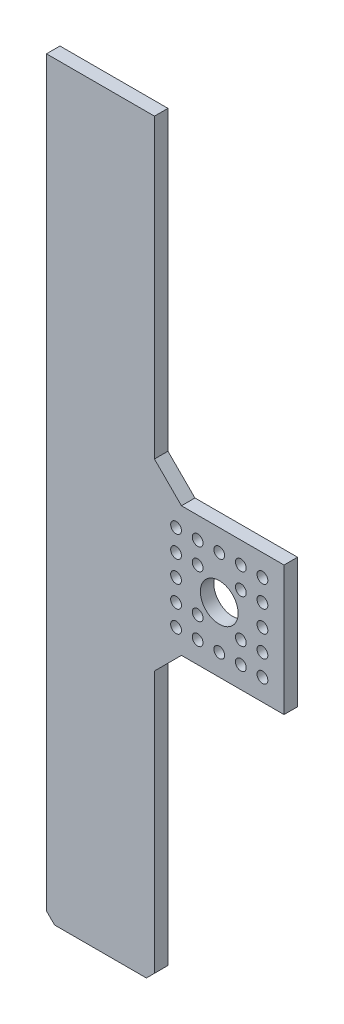
ISO-10303-21;
HEADER;
FILE_DESCRIPTION(('STEP AP214'),'2;1');
FILE_NAME('part.step','',(''),(''),'','','');
FILE_SCHEMA(('AUTOMOTIVE_DESIGN { 1 0 10303 214 1 1 1 1 }'));
ENDSEC;
DATA;
#1=APPLICATION_CONTEXT('core data for automotive mechanical design processes');
#2=APPLICATION_PROTOCOL_DEFINITION('international standard','automotive_design',2000,#1);
#3=PRODUCT_CONTEXT('',#1,'mechanical');
#4=PRODUCT('Part','Part','',(#3));
#5=PRODUCT_RELATED_PRODUCT_CATEGORY('part','',(#4));
#6=PRODUCT_DEFINITION_FORMATION('','',#4);
#7=PRODUCT_DEFINITION_CONTEXT('part definition',#1,'design');
#8=PRODUCT_DEFINITION('design','',#6,#7);
#9=PRODUCT_DEFINITION_SHAPE('','',#8);
#10=(LENGTH_UNIT() NAMED_UNIT(*) SI_UNIT(.MILLI.,.METRE.));
#11=(NAMED_UNIT(*) PLANE_ANGLE_UNIT() SI_UNIT($,.RADIAN.));
#12=(NAMED_UNIT(*) SI_UNIT($,.STERADIAN.) SOLID_ANGLE_UNIT());
#13=UNCERTAINTY_MEASURE_WITH_UNIT(LENGTH_MEASURE(1.E-05),#10,'distance_accuracy_value','');
#14=(GEOMETRIC_REPRESENTATION_CONTEXT(3) GLOBAL_UNCERTAINTY_ASSIGNED_CONTEXT((#13)) GLOBAL_UNIT_ASSIGNED_CONTEXT((#10,
#11,#12)) REPRESENTATION_CONTEXT('',''));
#15=CARTESIAN_POINT('',(0.,0.,0.));
#16=DIRECTION('',(0.,0.,1.));
#17=DIRECTION('',(1.,0.,0.));
#18=AXIS2_PLACEMENT_3D('',#15,#16,#17);
#19=CARTESIAN_POINT('',(0.,0.,5.));
#20=DIRECTION('',(0.,0.,1.));
#21=DIRECTION('',(1.,0.,0.));
#22=AXIS2_PLACEMENT_3D('',#19,#20,#21);
#23=PLANE('',#22);
#24=CARTESIAN_POINT('',(48.0000000000002,-152.,5.));
#25=DIRECTION('',(0.,0.,1.));
#26=DIRECTION('',(1.,0.,0.));
#27=AXIS2_PLACEMENT_3D('',#24,#25,#26);
#28=CIRCLE('',#27,2.);
#29=CARTESIAN_POINT('',(50.0000000000003,-152.,5.));
#30=VERTEX_POINT('',#29);
#31=EDGE_CURVE('E442',#30,#30,#28,.T.);
#32=ORIENTED_EDGE('',*,*,#31,.F.);
#33=EDGE_LOOP('',(#32));
#34=FACE_BOUND('',#33,.T.);
#35=CARTESIAN_POINT('',(48.0000000000001,-136.,5.));
#36=DIRECTION('',(0.,0.,1.));
#37=DIRECTION('',(1.,0.,0.));
#38=AXIS2_PLACEMENT_3D('',#35,#36,#37);
#39=CIRCLE('',#38,2.);
#40=CARTESIAN_POINT('',(50.0000000000001,-136.,5.));
#41=VERTEX_POINT('',#40);
#42=EDGE_CURVE('E426',#41,#41,#39,.T.);
#43=ORIENTED_EDGE('',*,*,#42,.F.);
#44=EDGE_LOOP('',(#43));
#45=FACE_BOUND('',#44,.T.);
#46=CARTESIAN_POINT('',(72.0000000000003,-160.,5.));
#47=DIRECTION('',(0.,0.,1.));
#48=DIRECTION('',(1.,0.,0.));
#49=AXIS2_PLACEMENT_3D('',#46,#47,#48);
#50=CIRCLE('',#49,2.00000000000001);
#51=CARTESIAN_POINT('',(74.0000000000003,-160.,5.));
#52=VERTEX_POINT('',#51);
#53=EDGE_CURVE('E410',#52,#52,#50,.T.);
#54=ORIENTED_EDGE('',*,*,#53,.F.);
#55=EDGE_LOOP('',(#54));
#56=FACE_BOUND('',#55,.T.);
#57=CARTESIAN_POINT('',(56.0000000000003,-160.,5.));
#58=DIRECTION('',(0.,0.,1.));
#59=DIRECTION('',(1.,0.,0.));
#60=AXIS2_PLACEMENT_3D('',#57,#58,#59);
#61=CIRCLE('',#60,2.);
#62=CARTESIAN_POINT('',(58.0000000000003,-160.,5.));
#63=VERTEX_POINT('',#62);
#64=EDGE_CURVE('E394',#63,#63,#61,.T.);
#65=ORIENTED_EDGE('',*,*,#64,.F.);
#66=EDGE_LOOP('',(#65));
#67=FACE_BOUND('',#66,.T.);
#68=CARTESIAN_POINT('',(72.0000000000002,-152.,5.));
#69=DIRECTION('',(0.,0.,1.));
#70=DIRECTION('',(1.,0.,0.));
#71=AXIS2_PLACEMENT_3D('',#68,#69,#70);
#72=CIRCLE('',#71,2.00000000000001);
#73=CARTESIAN_POINT('',(74.0000000000002,-152.,5.));
#74=VERTEX_POINT('',#73);
#75=EDGE_CURVE('E378',#74,#74,#72,.T.);
#76=ORIENTED_EDGE('',*,*,#75,.F.);
#77=EDGE_LOOP('',(#76));
#78=FACE_BOUND('',#77,.T.);
#79=CARTESIAN_POINT('',(80.0000000000001,-144.,5.));
#80=DIRECTION('',(0.,0.,1.));
#81=DIRECTION('',(1.,0.,0.));
#82=AXIS2_PLACEMENT_3D('',#79,#80,#81);
#83=CIRCLE('',#82,2.);
#84=CARTESIAN_POINT('',(82.0000000000001,-144.,5.));
#85=VERTEX_POINT('',#84);
#86=EDGE_CURVE('E362',#85,#85,#83,.T.);
#87=ORIENTED_EDGE('',*,*,#86,.F.);
#88=EDGE_LOOP('',(#87));
#89=FACE_BOUND('',#88,.T.);
#90=CARTESIAN_POINT('',(72.0000000000001,-136.,5.));
#91=DIRECTION('',(0.,0.,1.));
#92=DIRECTION('',(1.,0.,0.));
#93=AXIS2_PLACEMENT_3D('',#90,#91,#92);
#94=CIRCLE('',#93,2.00000000000001);
#95=CARTESIAN_POINT('',(74.0000000000001,-136.,5.));
#96=VERTEX_POINT('',#95);
#97=EDGE_CURVE('E346',#96,#96,#94,.T.);
#98=ORIENTED_EDGE('',*,*,#97,.F.);
#99=EDGE_LOOP('',(#98));
#100=FACE_BOUND('',#99,.T.);
#101=CARTESIAN_POINT('',(80.,-128.,5.));
#102=DIRECTION('',(0.,0.,1.));
#103=DIRECTION('',(1.,0.,0.));
#104=AXIS2_PLACEMENT_3D('',#101,#102,#103);
#105=CIRCLE('',#104,2.);
#106=CARTESIAN_POINT('',(82.,-128.,5.));
#107=VERTEX_POINT('',#106);
#108=EDGE_CURVE('E330',#107,#107,#105,.T.);
#109=ORIENTED_EDGE('',*,*,#108,.F.);
#110=EDGE_LOOP('',(#109));
#111=FACE_BOUND('',#110,.T.);
#112=CARTESIAN_POINT('',(64.,-128.,5.));
#113=DIRECTION('',(0.,0.,1.));
#114=DIRECTION('',(1.,0.,0.));
#115=AXIS2_PLACEMENT_3D('',#112,#113,#114);
#116=CIRCLE('',#115,2.00000000000001);
#117=CARTESIAN_POINT('',(66.,-128.,5.));
#118=VERTEX_POINT('',#117);
#119=EDGE_CURVE('E314',#118,#118,#116,.T.);
#120=ORIENTED_EDGE('',*,*,#119,.F.);
#121=EDGE_LOOP('',(#120));
#122=FACE_BOUND('',#121,.T.);
#123=CARTESIAN_POINT('',(48.,-128.,5.));
#124=DIRECTION('',(0.,0.,1.));
#125=DIRECTION('',(1.,0.,0.));
#126=AXIS2_PLACEMENT_3D('',#123,#124,#125);
#127=CIRCLE('',#126,2.);
#128=CARTESIAN_POINT('',(50.,-128.,5.));
#129=VERTEX_POINT('',#128);
#130=EDGE_CURVE('E298',#129,#129,#127,.T.);
#131=ORIENTED_EDGE('',*,*,#130,.F.);
#132=EDGE_LOOP('',(#131));
#133=FACE_BOUND('',#132,.T.);
#134=DIRECTION('',(0.,-1.,0.));
#135=VECTOR('',#134,1.);
#136=CARTESIAN_POINT('',(0.,0.,5.));
#137=LINE('',#136,#135);
#138=CARTESIAN_POINT('',(0.,0.,5.));
#139=VERTEX_POINT('',#138);
#140=CARTESIAN_POINT('',(0.,-275.,5.));
#141=VERTEX_POINT('',#140);
#142=EDGE_CURVE('E132',#139,#141,#137,.T.);
#143=ORIENTED_EDGE('',*,*,#142,.T.);
#144=DIRECTION('',(-0.707106781186541,0.707106781186554,0.));
#145=VECTOR('',#144,1.);
#146=CARTESIAN_POINT('',(-137.5,-137.499999999997,5.));
#147=LINE('',#146,#145);
#148=CARTESIAN_POINT('',(3.00000000000004,-278.,5.));
#149=VERTEX_POINT('',#148);
#150=EDGE_CURVE('E187',#141,#149,#147,.F.);
#151=ORIENTED_EDGE('',*,*,#150,.T.);
#152=DIRECTION('',(1.,0.,0.));
#153=VECTOR('',#152,1.);
#154=CARTESIAN_POINT('',(0.,-278.,5.));
#155=LINE('',#154,#153);
#156=CARTESIAN_POINT('',(37.,-278.,5.));
#157=VERTEX_POINT('',#156);
#158=EDGE_CURVE('E144',#149,#157,#155,.T.);
#159=ORIENTED_EDGE('',*,*,#158,.T.);
#160=DIRECTION('',(-0.707106781186548,-0.707106781186548,0.));
#161=VECTOR('',#160,1.);
#162=CARTESIAN_POINT('',(157.5,-157.5,5.));
#163=LINE('',#162,#161);
#164=CARTESIAN_POINT('',(40.,-275.,5.));
#165=VERTEX_POINT('',#164);
#166=EDGE_CURVE('E184',#157,#165,#163,.F.);
#167=ORIENTED_EDGE('',*,*,#166,.T.);
#168=DIRECTION('',(0.,1.,0.));
#169=VECTOR('',#168,1.);
#170=CARTESIAN_POINT('',(40.,-278.,5.));
#171=LINE('',#170,#169);
#172=CARTESIAN_POINT('',(40.,-178.,5.));
#173=VERTEX_POINT('',#172);
#174=EDGE_CURVE('E219',#165,#173,#171,.T.);
#175=ORIENTED_EDGE('',*,*,#174,.T.);
#176=DIRECTION('',(-0.707106781186551,-0.707106781186544,0.));
#177=VECTOR('',#176,1.);
#178=CARTESIAN_POINT('',(50.0000000000001,-168.,5.));
#179=LINE('',#178,#177);
#180=CARTESIAN_POINT('',(50.0000000000001,-168.,5.));
#181=VERTEX_POINT('',#180);
#182=EDGE_CURVE('E210',#173,#181,#179,.F.);
#183=ORIENTED_EDGE('',*,*,#182,.T.);
#184=DIRECTION('',(1.,0.,0.));
#185=VECTOR('',#184,1.);
#186=CARTESIAN_POINT('',(40.,-168.,5.));
#187=LINE('',#186,#185);
#188=CARTESIAN_POINT('',(88.,-168.,5.));
#189=VERTEX_POINT('',#188);
#190=EDGE_CURVE('E216',#181,#189,#187,.T.);
#191=ORIENTED_EDGE('',*,*,#190,.T.);
#192=DIRECTION('',(0.,1.,0.));
#193=VECTOR('',#192,1.);
#194=CARTESIAN_POINT('',(88.,-168.,5.));
#195=LINE('',#194,#193);
#196=CARTESIAN_POINT('',(88.,-120.,5.));
#197=VERTEX_POINT('',#196);
#198=EDGE_CURVE('E228',#189,#197,#195,.T.);
#199=ORIENTED_EDGE('',*,*,#198,.T.);
#200=DIRECTION('',(-1.,0.,0.));
#201=VECTOR('',#200,1.);
#202=CARTESIAN_POINT('',(88.,-120.,5.));
#203=LINE('',#202,#201);
#204=CARTESIAN_POINT('',(49.9999999999999,-120.,5.));
#205=VERTEX_POINT('',#204);
#206=EDGE_CURVE('E267',#197,#205,#203,.T.);
#207=ORIENTED_EDGE('',*,*,#206,.T.);
#208=DIRECTION('',(0.707106781186544,-0.707106781186551,0.));
#209=VECTOR('',#208,1.);
#210=CARTESIAN_POINT('',(40.,-110.,5.));
#211=LINE('',#210,#209);
#212=CARTESIAN_POINT('',(40.,-110.,5.));
#213=VERTEX_POINT('',#212);
#214=EDGE_CURVE('E11',#205,#213,#211,.F.);
#215=ORIENTED_EDGE('',*,*,#214,.T.);
#216=DIRECTION('',(0.,1.,0.));
#217=VECTOR('',#216,1.);
#218=CARTESIAN_POINT('',(40.,-120.,5.));
#219=LINE('',#218,#217);
#220=CARTESIAN_POINT('',(40.,0.,5.));
#221=VERTEX_POINT('',#220);
#222=EDGE_CURVE('E150',#213,#221,#219,.T.);
#223=ORIENTED_EDGE('',*,*,#222,.T.);
#224=DIRECTION('',(-1.,0.,0.));
#225=VECTOR('',#224,1.);
#226=CARTESIAN_POINT('',(40.,0.,5.));
#227=LINE('',#226,#225);
#228=EDGE_CURVE('E145',#221,#139,#227,.T.);
#229=ORIENTED_EDGE('',*,*,#228,.T.);
#230=EDGE_LOOP('',(#143,#151,#159,#167,#175,#183,#191,#199,#207,#215,#223,#229));
#231=FACE_BOUND('',#230,.T.);
#232=CARTESIAN_POINT('',(64.,-144.,5.));
#233=DIRECTION('',(0.,0.,1.));
#234=DIRECTION('',(1.,0.,0.));
#235=AXIS2_PLACEMENT_3D('',#232,#233,#234);
#236=CIRCLE('',#235,7.);
#237=CARTESIAN_POINT('',(71.,-144.,5.));
#238=VERTEX_POINT('',#237);
#239=EDGE_CURVE('E279',#238,#238,#236,.T.);
#240=ORIENTED_EDGE('',*,*,#239,.F.);
#241=EDGE_LOOP('',(#240));
#242=FACE_BOUND('',#241,.T.);
#243=CARTESIAN_POINT('',(56.,-128.,5.));
#244=DIRECTION('',(0.,0.,1.));
#245=DIRECTION('',(1.,0.,0.));
#246=AXIS2_PLACEMENT_3D('',#243,#244,#245);
#247=CIRCLE('',#246,2.);
#248=CARTESIAN_POINT('',(58.,-128.,5.));
#249=VERTEX_POINT('',#248);
#250=EDGE_CURVE('E306',#249,#249,#247,.T.);
#251=ORIENTED_EDGE('',*,*,#250,.F.);
#252=EDGE_LOOP('',(#251));
#253=FACE_BOUND('',#252,.T.);
#254=CARTESIAN_POINT('',(72.,-128.,5.));
#255=DIRECTION('',(0.,0.,1.));
#256=DIRECTION('',(1.,0.,0.));
#257=AXIS2_PLACEMENT_3D('',#254,#255,#256);
#258=CIRCLE('',#257,2.00000000000001);
#259=CARTESIAN_POINT('',(74.,-128.,5.));
#260=VERTEX_POINT('',#259);
#261=EDGE_CURVE('E322',#260,#260,#258,.T.);
#262=ORIENTED_EDGE('',*,*,#261,.F.);
#263=EDGE_LOOP('',(#262));
#264=FACE_BOUND('',#263,.T.);
#265=CARTESIAN_POINT('',(56.0000000000001,-136.,5.));
#266=DIRECTION('',(0.,0.,1.));
#267=DIRECTION('',(1.,0.,0.));
#268=AXIS2_PLACEMENT_3D('',#265,#266,#267);
#269=CIRCLE('',#268,2.);
#270=CARTESIAN_POINT('',(58.0000000000001,-136.,5.));
#271=VERTEX_POINT('',#270);
#272=EDGE_CURVE('E338',#271,#271,#269,.T.);
#273=ORIENTED_EDGE('',*,*,#272,.F.);
#274=EDGE_LOOP('',(#273));
#275=FACE_BOUND('',#274,.T.);
#276=CARTESIAN_POINT('',(80.0000000000001,-136.,5.));
#277=DIRECTION('',(0.,0.,1.));
#278=DIRECTION('',(1.,0.,0.));
#279=AXIS2_PLACEMENT_3D('',#276,#277,#278);
#280=CIRCLE('',#279,2.);
#281=CARTESIAN_POINT('',(82.0000000000001,-136.,5.));
#282=VERTEX_POINT('',#281);
#283=EDGE_CURVE('E354',#282,#282,#280,.T.);
#284=ORIENTED_EDGE('',*,*,#283,.F.);
#285=EDGE_LOOP('',(#284));
#286=FACE_BOUND('',#285,.T.);
#287=CARTESIAN_POINT('',(56.0000000000002,-152.,5.));
#288=DIRECTION('',(0.,0.,1.));
#289=DIRECTION('',(1.,0.,0.));
#290=AXIS2_PLACEMENT_3D('',#287,#288,#289);
#291=CIRCLE('',#290,2.);
#292=CARTESIAN_POINT('',(58.0000000000002,-152.,5.));
#293=VERTEX_POINT('',#292);
#294=EDGE_CURVE('E370',#293,#293,#291,.T.);
#295=ORIENTED_EDGE('',*,*,#294,.F.);
#296=EDGE_LOOP('',(#295));
#297=FACE_BOUND('',#296,.T.);
#298=CARTESIAN_POINT('',(80.0000000000002,-152.,5.));
#299=DIRECTION('',(0.,0.,1.));
#300=DIRECTION('',(1.,0.,0.));
#301=AXIS2_PLACEMENT_3D('',#298,#299,#300);
#302=CIRCLE('',#301,2.);
#303=CARTESIAN_POINT('',(82.0000000000002,-152.,5.));
#304=VERTEX_POINT('',#303);
#305=EDGE_CURVE('E386',#304,#304,#302,.T.);
#306=ORIENTED_EDGE('',*,*,#305,.F.);
#307=EDGE_LOOP('',(#306));
#308=FACE_BOUND('',#307,.T.);
#309=CARTESIAN_POINT('',(64.0000000000003,-160.,5.));
#310=DIRECTION('',(0.,0.,1.));
#311=DIRECTION('',(1.,0.,0.));
#312=AXIS2_PLACEMENT_3D('',#309,#310,#311);
#313=CIRCLE('',#312,2.00000000000001);
#314=CARTESIAN_POINT('',(66.0000000000003,-160.,5.));
#315=VERTEX_POINT('',#314);
#316=EDGE_CURVE('E402',#315,#315,#313,.T.);
#317=ORIENTED_EDGE('',*,*,#316,.F.);
#318=EDGE_LOOP('',(#317));
#319=FACE_BOUND('',#318,.T.);
#320=CARTESIAN_POINT('',(80.0000000000003,-160.,5.));
#321=DIRECTION('',(0.,0.,1.));
#322=DIRECTION('',(1.,0.,0.));
#323=AXIS2_PLACEMENT_3D('',#320,#321,#322);
#324=CIRCLE('',#323,2.);
#325=CARTESIAN_POINT('',(82.0000000000003,-160.,5.));
#326=VERTEX_POINT('',#325);
#327=EDGE_CURVE('E418',#326,#326,#324,.T.);
#328=ORIENTED_EDGE('',*,*,#327,.F.);
#329=EDGE_LOOP('',(#328));
#330=FACE_BOUND('',#329,.T.);
#331=CARTESIAN_POINT('',(48.0000000000002,-144.,5.));
#332=DIRECTION('',(0.,0.,1.));
#333=DIRECTION('',(1.,0.,0.));
#334=AXIS2_PLACEMENT_3D('',#331,#332,#333);
#335=CIRCLE('',#334,2.);
#336=CARTESIAN_POINT('',(50.0000000000002,-144.,5.));
#337=VERTEX_POINT('',#336);
#338=EDGE_CURVE('E434',#337,#337,#335,.T.);
#339=ORIENTED_EDGE('',*,*,#338,.F.);
#340=EDGE_LOOP('',(#339));
#341=FACE_BOUND('',#340,.T.);
#342=CARTESIAN_POINT('',(48.0000000000003,-160.,5.));
#343=DIRECTION('',(0.,0.,1.));
#344=DIRECTION('',(1.,0.,0.));
#345=AXIS2_PLACEMENT_3D('',#342,#343,#344);
#346=CIRCLE('',#345,2.);
#347=CARTESIAN_POINT('',(50.0000000000003,-160.,5.));
#348=VERTEX_POINT('',#347);
#349=EDGE_CURVE('E450',#348,#348,#346,.T.);
#350=ORIENTED_EDGE('',*,*,#349,.F.);
#351=EDGE_LOOP('',(#350));
#352=FACE_BOUND('',#351,.T.);
#353=ADVANCED_FACE('F41',(#34,#45,#56,#67,#78,#89,#100,#111,#122,#133,#231,#242,#253,#264,#275,
#286,#297,#308,#319,#330,#341,#352),#23,.T.);
#354=CARTESIAN_POINT('',(0.,0.,0.));
#355=DIRECTION('',(0.,0.,1.));
#356=DIRECTION('',(1.,0.,0.));
#357=AXIS2_PLACEMENT_3D('',#354,#355,#356);
#358=PLANE('',#357);
#359=DIRECTION('',(1.,0.,0.));
#360=VECTOR('',#359,1.);
#361=CARTESIAN_POINT('',(0.,-278.,0.));
#362=LINE('',#361,#360);
#363=CARTESIAN_POINT('',(3.00000000000004,-278.,0.));
#364=VERTEX_POINT('',#363);
#365=CARTESIAN_POINT('',(37.,-278.,0.));
#366=VERTEX_POINT('',#365);
#367=EDGE_CURVE('E243',#364,#366,#362,.T.);
#368=ORIENTED_EDGE('',*,*,#367,.F.);
#369=DIRECTION('',(0.707106781186541,-0.707106781186554,0.));
#370=VECTOR('',#369,1.);
#371=CARTESIAN_POINT('',(3.00000000000004,-278.,0.));
#372=LINE('',#371,#370);
#373=CARTESIAN_POINT('',(0.,-275.,0.));
#374=VERTEX_POINT('',#373);
#375=EDGE_CURVE('E179',#364,#374,#372,.F.);
#376=ORIENTED_EDGE('',*,*,#375,.T.);
#377=DIRECTION('',(0.,-1.,0.));
#378=VECTOR('',#377,1.);
#379=CARTESIAN_POINT('',(0.,0.,0.));
#380=LINE('',#379,#378);
#381=CARTESIAN_POINT('',(0.,0.,0.));
#382=VERTEX_POINT('',#381);
#383=EDGE_CURVE('E250',#382,#374,#380,.T.);
#384=ORIENTED_EDGE('',*,*,#383,.F.);
#385=DIRECTION('',(-1.,0.,0.));
#386=VECTOR('',#385,1.);
#387=CARTESIAN_POINT('',(40.,0.,0.));
#388=LINE('',#387,#386);
#389=CARTESIAN_POINT('',(40.,0.,0.));
#390=VERTEX_POINT('',#389);
#391=EDGE_CURVE('E159',#390,#382,#388,.T.);
#392=ORIENTED_EDGE('',*,*,#391,.F.);
#393=DIRECTION('',(0.,1.,0.));
#394=VECTOR('',#393,1.);
#395=CARTESIAN_POINT('',(40.,-120.,0.));
#396=LINE('',#395,#394);
#397=CARTESIAN_POINT('',(40.,-110.,0.));
#398=VERTEX_POINT('',#397);
#399=EDGE_CURVE('E155',#398,#390,#396,.T.);
#400=ORIENTED_EDGE('',*,*,#399,.F.);
#401=DIRECTION('',(-0.707106781186544,0.707106781186551,0.));
#402=VECTOR('',#401,1.);
#403=CARTESIAN_POINT('',(-34.9999999999998,-34.9999999999994,0.));
#404=LINE('',#403,#402);
#405=CARTESIAN_POINT('',(49.9999999999999,-120.,0.));
#406=VERTEX_POINT('',#405);
#407=EDGE_CURVE('E51',#398,#406,#404,.F.);
#408=ORIENTED_EDGE('',*,*,#407,.T.);
#409=DIRECTION('',(-1.,0.,0.));
#410=VECTOR('',#409,1.);
#411=CARTESIAN_POINT('',(88.,-120.,0.));
#412=LINE('',#411,#410);
#413=CARTESIAN_POINT('',(88.,-120.,0.));
#414=VERTEX_POINT('',#413);
#415=EDGE_CURVE('E256',#414,#406,#412,.T.);
#416=ORIENTED_EDGE('',*,*,#415,.F.);
#417=DIRECTION('',(0.,1.,0.));
#418=VECTOR('',#417,1.);
#419=CARTESIAN_POINT('',(88.,-168.,0.));
#420=LINE('',#419,#418);
#421=CARTESIAN_POINT('',(88.,-168.,0.));
#422=VERTEX_POINT('',#421);
#423=EDGE_CURVE('E247',#422,#414,#420,.T.);
#424=ORIENTED_EDGE('',*,*,#423,.F.);
#425=DIRECTION('',(1.,0.,0.));
#426=VECTOR('',#425,1.);
#427=CARTESIAN_POINT('',(40.,-168.,0.));
#428=LINE('',#427,#426);
#429=CARTESIAN_POINT('',(50.0000000000001,-168.,0.));
#430=VERTEX_POINT('',#429);
#431=EDGE_CURVE('E238',#430,#422,#428,.T.);
#432=ORIENTED_EDGE('',*,*,#431,.F.);
#433=DIRECTION('',(0.707106781186551,0.707106781186544,0.));
#434=VECTOR('',#433,1.);
#435=CARTESIAN_POINT('',(109.,-109.000000000001,0.));
#436=LINE('',#435,#434);
#437=CARTESIAN_POINT('',(40.,-178.,0.));
#438=VERTEX_POINT('',#437);
#439=EDGE_CURVE('E207',#430,#438,#436,.F.);
#440=ORIENTED_EDGE('',*,*,#439,.T.);
#441=DIRECTION('',(0.,1.,0.));
#442=VECTOR('',#441,1.);
#443=CARTESIAN_POINT('',(40.,-278.,0.));
#444=LINE('',#443,#442);
#445=CARTESIAN_POINT('',(40.,-275.,0.));
#446=VERTEX_POINT('',#445);
#447=EDGE_CURVE('E236',#446,#438,#444,.T.);
#448=ORIENTED_EDGE('',*,*,#447,.F.);
#449=DIRECTION('',(0.707106781186548,0.707106781186548,0.));
#450=VECTOR('',#449,1.);
#451=CARTESIAN_POINT('',(40.,-275.,0.));
#452=LINE('',#451,#450);
#453=EDGE_CURVE('E176',#446,#366,#452,.F.);
#454=ORIENTED_EDGE('',*,*,#453,.T.);
#455=EDGE_LOOP('',(#368,#376,#384,#392,#400,#408,#416,#424,#432,#440,#448,#454));
#456=FACE_BOUND('',#455,.T.);
#457=CARTESIAN_POINT('',(64.,-144.,0.));
#458=DIRECTION('',(0.,0.,1.));
#459=DIRECTION('',(1.,0.,0.));
#460=AXIS2_PLACEMENT_3D('',#457,#458,#459);
#461=CIRCLE('',#460,7.);
#462=CARTESIAN_POINT('',(71.,-144.,0.));
#463=VERTEX_POINT('',#462);
#464=EDGE_CURVE('E294',#463,#463,#461,.T.);
#465=ORIENTED_EDGE('',*,*,#464,.T.);
#466=EDGE_LOOP('',(#465));
#467=FACE_BOUND('',#466,.T.);
#468=CARTESIAN_POINT('',(48.,-128.,0.));
#469=DIRECTION('',(0.,0.,1.));
#470=DIRECTION('',(1.,0.,0.));
#471=AXIS2_PLACEMENT_3D('',#468,#469,#470);
#472=CIRCLE('',#471,2.);
#473=CARTESIAN_POINT('',(50.,-128.,0.));
#474=VERTEX_POINT('',#473);
#475=EDGE_CURVE('E302',#474,#474,#472,.T.);
#476=ORIENTED_EDGE('',*,*,#475,.T.);
#477=EDGE_LOOP('',(#476));
#478=FACE_BOUND('',#477,.T.);
#479=CARTESIAN_POINT('',(56.,-128.,0.));
#480=DIRECTION('',(0.,0.,1.));
#481=DIRECTION('',(1.,0.,0.));
#482=AXIS2_PLACEMENT_3D('',#479,#480,#481);
#483=CIRCLE('',#482,2.);
#484=CARTESIAN_POINT('',(58.,-128.,0.));
#485=VERTEX_POINT('',#484);
#486=EDGE_CURVE('E310',#485,#485,#483,.T.);
#487=ORIENTED_EDGE('',*,*,#486,.T.);
#488=EDGE_LOOP('',(#487));
#489=FACE_BOUND('',#488,.T.);
#490=CARTESIAN_POINT('',(64.,-128.,0.));
#491=DIRECTION('',(0.,0.,1.));
#492=DIRECTION('',(1.,0.,0.));
#493=AXIS2_PLACEMENT_3D('',#490,#491,#492);
#494=CIRCLE('',#493,2.00000000000001);
#495=CARTESIAN_POINT('',(66.,-128.,0.));
#496=VERTEX_POINT('',#495);
#497=EDGE_CURVE('E318',#496,#496,#494,.T.);
#498=ORIENTED_EDGE('',*,*,#497,.T.);
#499=EDGE_LOOP('',(#498));
#500=FACE_BOUND('',#499,.T.);
#501=CARTESIAN_POINT('',(72.,-128.,0.));
#502=DIRECTION('',(0.,0.,1.));
#503=DIRECTION('',(1.,0.,0.));
#504=AXIS2_PLACEMENT_3D('',#501,#502,#503);
#505=CIRCLE('',#504,2.00000000000001);
#506=CARTESIAN_POINT('',(74.,-128.,0.));
#507=VERTEX_POINT('',#506);
#508=EDGE_CURVE('E326',#507,#507,#505,.T.);
#509=ORIENTED_EDGE('',*,*,#508,.T.);
#510=EDGE_LOOP('',(#509));
#511=FACE_BOUND('',#510,.T.);
#512=CARTESIAN_POINT('',(80.,-128.,0.));
#513=DIRECTION('',(0.,0.,1.));
#514=DIRECTION('',(1.,0.,0.));
#515=AXIS2_PLACEMENT_3D('',#512,#513,#514);
#516=CIRCLE('',#515,2.);
#517=CARTESIAN_POINT('',(82.,-128.,0.));
#518=VERTEX_POINT('',#517);
#519=EDGE_CURVE('E334',#518,#518,#516,.T.);
#520=ORIENTED_EDGE('',*,*,#519,.T.);
#521=EDGE_LOOP('',(#520));
#522=FACE_BOUND('',#521,.T.);
#523=CARTESIAN_POINT('',(56.0000000000001,-136.,0.));
#524=DIRECTION('',(0.,0.,1.));
#525=DIRECTION('',(1.,0.,0.));
#526=AXIS2_PLACEMENT_3D('',#523,#524,#525);
#527=CIRCLE('',#526,2.);
#528=CARTESIAN_POINT('',(58.0000000000001,-136.,0.));
#529=VERTEX_POINT('',#528);
#530=EDGE_CURVE('E342',#529,#529,#527,.T.);
#531=ORIENTED_EDGE('',*,*,#530,.T.);
#532=EDGE_LOOP('',(#531));
#533=FACE_BOUND('',#532,.T.);
#534=CARTESIAN_POINT('',(72.0000000000001,-136.,0.));
#535=DIRECTION('',(0.,0.,1.));
#536=DIRECTION('',(1.,0.,0.));
#537=AXIS2_PLACEMENT_3D('',#534,#535,#536);
#538=CIRCLE('',#537,2.00000000000001);
#539=CARTESIAN_POINT('',(74.0000000000001,-136.,0.));
#540=VERTEX_POINT('',#539);
#541=EDGE_CURVE('E350',#540,#540,#538,.T.);
#542=ORIENTED_EDGE('',*,*,#541,.T.);
#543=EDGE_LOOP('',(#542));
#544=FACE_BOUND('',#543,.T.);
#545=CARTESIAN_POINT('',(80.0000000000001,-136.,0.));
#546=DIRECTION('',(0.,0.,1.));
#547=DIRECTION('',(1.,0.,0.));
#548=AXIS2_PLACEMENT_3D('',#545,#546,#547);
#549=CIRCLE('',#548,2.);
#550=CARTESIAN_POINT('',(82.0000000000001,-136.,0.));
#551=VERTEX_POINT('',#550);
#552=EDGE_CURVE('E358',#551,#551,#549,.T.);
#553=ORIENTED_EDGE('',*,*,#552,.T.);
#554=EDGE_LOOP('',(#553));
#555=FACE_BOUND('',#554,.T.);
#556=CARTESIAN_POINT('',(80.0000000000001,-144.,0.));
#557=DIRECTION('',(0.,0.,1.));
#558=DIRECTION('',(1.,0.,0.));
#559=AXIS2_PLACEMENT_3D('',#556,#557,#558);
#560=CIRCLE('',#559,2.);
#561=CARTESIAN_POINT('',(82.0000000000001,-144.,0.));
#562=VERTEX_POINT('',#561);
#563=EDGE_CURVE('E366',#562,#562,#560,.T.);
#564=ORIENTED_EDGE('',*,*,#563,.T.);
#565=EDGE_LOOP('',(#564));
#566=FACE_BOUND('',#565,.T.);
#567=CARTESIAN_POINT('',(56.0000000000002,-152.,0.));
#568=DIRECTION('',(0.,0.,1.));
#569=DIRECTION('',(1.,0.,0.));
#570=AXIS2_PLACEMENT_3D('',#567,#568,#569);
#571=CIRCLE('',#570,2.);
#572=CARTESIAN_POINT('',(58.0000000000002,-152.,0.));
#573=VERTEX_POINT('',#572);
#574=EDGE_CURVE('E374',#573,#573,#571,.T.);
#575=ORIENTED_EDGE('',*,*,#574,.T.);
#576=EDGE_LOOP('',(#575));
#577=FACE_BOUND('',#576,.T.);
#578=CARTESIAN_POINT('',(72.0000000000002,-152.,0.));
#579=DIRECTION('',(0.,0.,1.));
#580=DIRECTION('',(1.,0.,0.));
#581=AXIS2_PLACEMENT_3D('',#578,#579,#580);
#582=CIRCLE('',#581,2.00000000000001);
#583=CARTESIAN_POINT('',(74.0000000000002,-152.,0.));
#584=VERTEX_POINT('',#583);
#585=EDGE_CURVE('E382',#584,#584,#582,.T.);
#586=ORIENTED_EDGE('',*,*,#585,.T.);
#587=EDGE_LOOP('',(#586));
#588=FACE_BOUND('',#587,.T.);
#589=CARTESIAN_POINT('',(80.0000000000002,-152.,0.));
#590=DIRECTION('',(0.,0.,1.));
#591=DIRECTION('',(1.,0.,0.));
#592=AXIS2_PLACEMENT_3D('',#589,#590,#591);
#593=CIRCLE('',#592,2.);
#594=CARTESIAN_POINT('',(82.0000000000002,-152.,0.));
#595=VERTEX_POINT('',#594);
#596=EDGE_CURVE('E390',#595,#595,#593,.T.);
#597=ORIENTED_EDGE('',*,*,#596,.T.);
#598=EDGE_LOOP('',(#597));
#599=FACE_BOUND('',#598,.T.);
#600=CARTESIAN_POINT('',(56.0000000000003,-160.,0.));
#601=DIRECTION('',(0.,0.,1.));
#602=DIRECTION('',(1.,0.,0.));
#603=AXIS2_PLACEMENT_3D('',#600,#601,#602);
#604=CIRCLE('',#603,2.);
#605=CARTESIAN_POINT('',(58.0000000000003,-160.,0.));
#606=VERTEX_POINT('',#605);
#607=EDGE_CURVE('E398',#606,#606,#604,.T.);
#608=ORIENTED_EDGE('',*,*,#607,.T.);
#609=EDGE_LOOP('',(#608));
#610=FACE_BOUND('',#609,.T.);
#611=CARTESIAN_POINT('',(64.0000000000003,-160.,0.));
#612=DIRECTION('',(0.,0.,1.));
#613=DIRECTION('',(1.,0.,0.));
#614=AXIS2_PLACEMENT_3D('',#611,#612,#613);
#615=CIRCLE('',#614,2.00000000000001);
#616=CARTESIAN_POINT('',(66.0000000000003,-160.,0.));
#617=VERTEX_POINT('',#616);
#618=EDGE_CURVE('E406',#617,#617,#615,.T.);
#619=ORIENTED_EDGE('',*,*,#618,.T.);
#620=EDGE_LOOP('',(#619));
#621=FACE_BOUND('',#620,.T.);
#622=CARTESIAN_POINT('',(72.0000000000003,-160.,0.));
#623=DIRECTION('',(0.,0.,1.));
#624=DIRECTION('',(1.,0.,0.));
#625=AXIS2_PLACEMENT_3D('',#622,#623,#624);
#626=CIRCLE('',#625,2.00000000000001);
#627=CARTESIAN_POINT('',(74.0000000000003,-160.,0.));
#628=VERTEX_POINT('',#627);
#629=EDGE_CURVE('E414',#628,#628,#626,.T.);
#630=ORIENTED_EDGE('',*,*,#629,.T.);
#631=EDGE_LOOP('',(#630));
#632=FACE_BOUND('',#631,.T.);
#633=CARTESIAN_POINT('',(80.0000000000003,-160.,0.));
#634=DIRECTION('',(0.,0.,1.));
#635=DIRECTION('',(1.,0.,0.));
#636=AXIS2_PLACEMENT_3D('',#633,#634,#635);
#637=CIRCLE('',#636,2.);
#638=CARTESIAN_POINT('',(82.0000000000003,-160.,0.));
#639=VERTEX_POINT('',#638);
#640=EDGE_CURVE('E422',#639,#639,#637,.T.);
#641=ORIENTED_EDGE('',*,*,#640,.T.);
#642=EDGE_LOOP('',(#641));
#643=FACE_BOUND('',#642,.T.);
#644=CARTESIAN_POINT('',(48.0000000000001,-136.,0.));
#645=DIRECTION('',(0.,0.,1.));
#646=DIRECTION('',(1.,0.,0.));
#647=AXIS2_PLACEMENT_3D('',#644,#645,#646);
#648=CIRCLE('',#647,2.);
#649=CARTESIAN_POINT('',(50.0000000000001,-136.,0.));
#650=VERTEX_POINT('',#649);
#651=EDGE_CURVE('E430',#650,#650,#648,.T.);
#652=ORIENTED_EDGE('',*,*,#651,.T.);
#653=EDGE_LOOP('',(#652));
#654=FACE_BOUND('',#653,.T.);
#655=CARTESIAN_POINT('',(48.0000000000002,-144.,0.));
#656=DIRECTION('',(0.,0.,1.));
#657=DIRECTION('',(1.,0.,0.));
#658=AXIS2_PLACEMENT_3D('',#655,#656,#657);
#659=CIRCLE('',#658,2.);
#660=CARTESIAN_POINT('',(50.0000000000002,-144.,0.));
#661=VERTEX_POINT('',#660);
#662=EDGE_CURVE('E438',#661,#661,#659,.T.);
#663=ORIENTED_EDGE('',*,*,#662,.T.);
#664=EDGE_LOOP('',(#663));
#665=FACE_BOUND('',#664,.T.);
#666=CARTESIAN_POINT('',(48.0000000000002,-152.,0.));
#667=DIRECTION('',(0.,0.,1.));
#668=DIRECTION('',(1.,0.,0.));
#669=AXIS2_PLACEMENT_3D('',#666,#667,#668);
#670=CIRCLE('',#669,2.);
#671=CARTESIAN_POINT('',(50.0000000000003,-152.,0.));
#672=VERTEX_POINT('',#671);
#673=EDGE_CURVE('E446',#672,#672,#670,.T.);
#674=ORIENTED_EDGE('',*,*,#673,.T.);
#675=EDGE_LOOP('',(#674));
#676=FACE_BOUND('',#675,.T.);
#677=CARTESIAN_POINT('',(48.0000000000003,-160.,0.));
#678=DIRECTION('',(0.,0.,1.));
#679=DIRECTION('',(1.,0.,0.));
#680=AXIS2_PLACEMENT_3D('',#677,#678,#679);
#681=CIRCLE('',#680,2.);
#682=CARTESIAN_POINT('',(50.0000000000003,-160.,0.));
#683=VERTEX_POINT('',#682);
#684=EDGE_CURVE('E454',#683,#683,#681,.T.);
#685=ORIENTED_EDGE('',*,*,#684,.T.);
#686=EDGE_LOOP('',(#685));
#687=FACE_BOUND('',#686,.T.);
#688=ADVANCED_FACE('F234',(#456,#467,#478,#489,#500,#511,#522,#533,#544,#555,#566,#577,#588,
#599,#610,#621,#632,#643,#654,#665,#676,#687),#358,.F.);
#689=CARTESIAN_POINT('',(40.,0.,5.));
#690=DIRECTION('',(0.,-1.,0.));
#691=DIRECTION('',(1.,0.,0.));
#692=AXIS2_PLACEMENT_3D('',#689,#690,#691);
#693=PLANE('',#692);
#694=ORIENTED_EDGE('',*,*,#391,.T.);
#695=DIRECTION('',(0.,0.,-1.));
#696=VECTOR('',#695,1.);
#697=CARTESIAN_POINT('',(0.,0.,5.));
#698=LINE('',#697,#696);
#699=EDGE_CURVE('E137',#139,#382,#698,.T.);
#700=ORIENTED_EDGE('',*,*,#699,.F.);
#701=ORIENTED_EDGE('',*,*,#228,.F.);
#702=DIRECTION('',(0.,0.,-1.));
#703=VECTOR('',#702,1.);
#704=CARTESIAN_POINT('',(40.,0.,5.));
#705=LINE('',#704,#703);
#706=EDGE_CURVE('E261',#221,#390,#705,.T.);
#707=ORIENTED_EDGE('',*,*,#706,.T.);
#708=EDGE_LOOP('',(#694,#700,#701,#707));
#709=FACE_BOUND('',#708,.T.);
#710=ADVANCED_FACE('F157',(#709),#693,.F.);
#711=CARTESIAN_POINT('',(0.,0.,5.));
#712=DIRECTION('',(1.,0.,0.));
#713=DIRECTION('',(0.,1.,0.));
#714=AXIS2_PLACEMENT_3D('',#711,#712,#713);
#715=PLANE('',#714);
#716=ORIENTED_EDGE('',*,*,#383,.T.);
#717=DIRECTION('',(0.,0.,1.));
#718=VECTOR('',#717,1.);
#719=CARTESIAN_POINT('',(0.,-275.,5.));
#720=LINE('',#719,#718);
#721=EDGE_CURVE('E140',#374,#141,#720,.T.);
#722=ORIENTED_EDGE('',*,*,#721,.T.);
#723=ORIENTED_EDGE('',*,*,#142,.F.);
#724=ORIENTED_EDGE('',*,*,#699,.T.);
#725=EDGE_LOOP('',(#716,#722,#723,#724));
#726=FACE_BOUND('',#725,.T.);
#727=ADVANCED_FACE('F135',(#726),#715,.F.);
#728=CARTESIAN_POINT('',(0.,-278.,5.));
#729=DIRECTION('',(0.,1.,0.));
#730=DIRECTION('',(0.,0.,1.));
#731=AXIS2_PLACEMENT_3D('',#728,#729,#730);
#732=PLANE('',#731);
#733=ORIENTED_EDGE('',*,*,#158,.F.);
#734=DIRECTION('',(0.,0.,-1.));
#735=VECTOR('',#734,1.);
#736=CARTESIAN_POINT('',(3.00000000000004,-278.,5.));
#737=LINE('',#736,#735);
#738=EDGE_CURVE('E166',#149,#364,#737,.T.);
#739=ORIENTED_EDGE('',*,*,#738,.T.);
#740=ORIENTED_EDGE('',*,*,#367,.T.);
#741=DIRECTION('',(0.,0.,1.));
#742=VECTOR('',#741,1.);
#743=CARTESIAN_POINT('',(37.,-278.,5.));
#744=LINE('',#743,#742);
#745=EDGE_CURVE('E161',#366,#157,#744,.T.);
#746=ORIENTED_EDGE('',*,*,#745,.T.);
#747=EDGE_LOOP('',(#733,#739,#740,#746));
#748=FACE_BOUND('',#747,.T.);
#749=ADVANCED_FACE('F288',(#748),#732,.F.);
#750=CARTESIAN_POINT('',(40.,-278.,5.));
#751=DIRECTION('',(-1.,0.,0.));
#752=DIRECTION('',(0.,0.,1.));
#753=AXIS2_PLACEMENT_3D('',#750,#751,#752);
#754=PLANE('',#753);
#755=ORIENTED_EDGE('',*,*,#447,.T.);
#756=DIRECTION('',(0.,0.,1.));
#757=VECTOR('',#756,1.);
#758=CARTESIAN_POINT('',(40.,-178.,5.));
#759=LINE('',#758,#757);
#760=EDGE_CURVE('E198',#438,#173,#759,.T.);
#761=ORIENTED_EDGE('',*,*,#760,.T.);
#762=ORIENTED_EDGE('',*,*,#174,.F.);
#763=DIRECTION('',(0.,0.,-1.));
#764=VECTOR('',#763,1.);
#765=CARTESIAN_POINT('',(40.,-275.,5.));
#766=LINE('',#765,#764);
#767=EDGE_CURVE('E190',#165,#446,#766,.T.);
#768=ORIENTED_EDGE('',*,*,#767,.T.);
#769=EDGE_LOOP('',(#755,#761,#762,#768));
#770=FACE_BOUND('',#769,.T.);
#771=ADVANCED_FACE('F240',(#770),#754,.F.);
#772=CARTESIAN_POINT('',(40.,-168.,5.));
#773=DIRECTION('',(0.,1.,0.));
#774=DIRECTION('',(0.,0.,1.));
#775=AXIS2_PLACEMENT_3D('',#772,#773,#774);
#776=PLANE('',#775);
#777=ORIENTED_EDGE('',*,*,#190,.F.);
#778=DIRECTION('',(0.,0.,-1.));
#779=VECTOR('',#778,1.);
#780=CARTESIAN_POINT('',(50.0000000000001,-168.,0.));
#781=LINE('',#780,#779);
#782=EDGE_CURVE('E194',#181,#430,#781,.T.);
#783=ORIENTED_EDGE('',*,*,#782,.T.);
#784=ORIENTED_EDGE('',*,*,#431,.T.);
#785=DIRECTION('',(0.,0.,-1.));
#786=VECTOR('',#785,1.);
#787=CARTESIAN_POINT('',(88.,-168.,5.));
#788=LINE('',#787,#786);
#789=EDGE_CURVE('E162',#189,#422,#788,.T.);
#790=ORIENTED_EDGE('',*,*,#789,.F.);
#791=EDGE_LOOP('',(#777,#783,#784,#790));
#792=FACE_BOUND('',#791,.T.);
#793=ADVANCED_FACE('F224',(#792),#776,.F.);
#794=CARTESIAN_POINT('',(88.,-168.,5.));
#795=DIRECTION('',(-1.,0.,0.));
#796=DIRECTION('',(0.,-1.,0.));
#797=AXIS2_PLACEMENT_3D('',#794,#795,#796);
#798=PLANE('',#797);
#799=ORIENTED_EDGE('',*,*,#423,.T.);
#800=DIRECTION('',(0.,0.,-1.));
#801=VECTOR('',#800,1.);
#802=CARTESIAN_POINT('',(88.,-120.,5.));
#803=LINE('',#802,#801);
#804=EDGE_CURVE('E169',#197,#414,#803,.T.);
#805=ORIENTED_EDGE('',*,*,#804,.F.);
#806=ORIENTED_EDGE('',*,*,#198,.F.);
#807=ORIENTED_EDGE('',*,*,#789,.T.);
#808=EDGE_LOOP('',(#799,#805,#806,#807));
#809=FACE_BOUND('',#808,.T.);
#810=ADVANCED_FACE('F269',(#809),#798,.F.);
#811=CARTESIAN_POINT('',(88.,-120.,5.));
#812=DIRECTION('',(0.,-1.,0.));
#813=DIRECTION('',(1.,0.,0.));
#814=AXIS2_PLACEMENT_3D('',#811,#812,#813);
#815=PLANE('',#814);
#816=ORIENTED_EDGE('',*,*,#415,.T.);
#817=DIRECTION('',(0.,0.,1.));
#818=VECTOR('',#817,1.);
#819=CARTESIAN_POINT('',(49.9999999999999,-120.,5.));
#820=LINE('',#819,#818);
#821=EDGE_CURVE('E58',#406,#205,#820,.T.);
#822=ORIENTED_EDGE('',*,*,#821,.T.);
#823=ORIENTED_EDGE('',*,*,#206,.F.);
#824=ORIENTED_EDGE('',*,*,#804,.T.);
#825=EDGE_LOOP('',(#816,#822,#823,#824));
#826=FACE_BOUND('',#825,.T.);
#827=ADVANCED_FACE('F266',(#826),#815,.F.);
#828=CARTESIAN_POINT('',(40.,-120.,5.));
#829=DIRECTION('',(-1.,0.,0.));
#830=DIRECTION('',(0.,0.,1.));
#831=AXIS2_PLACEMENT_3D('',#828,#829,#830);
#832=PLANE('',#831);
#833=ORIENTED_EDGE('',*,*,#222,.F.);
#834=DIRECTION('',(0.,0.,-1.));
#835=VECTOR('',#834,1.);
#836=CARTESIAN_POINT('',(40.,-110.,0.));
#837=LINE('',#836,#835);
#838=EDGE_CURVE('E201',#213,#398,#837,.T.);
#839=ORIENTED_EDGE('',*,*,#838,.T.);
#840=ORIENTED_EDGE('',*,*,#399,.T.);
#841=ORIENTED_EDGE('',*,*,#706,.F.);
#842=EDGE_LOOP('',(#833,#839,#840,#841));
#843=FACE_BOUND('',#842,.T.);
#844=ADVANCED_FACE('F478',(#843),#832,.F.);
#845=CARTESIAN_POINT('',(64.,-144.,5.));
#846=DIRECTION('',(0.,0.,-1.));
#847=DIRECTION('',(-1.,0.,0.));
#848=AXIS2_PLACEMENT_3D('',#845,#846,#847);
#849=CYLINDRICAL_SURFACE('',#848,7.);
#850=ORIENTED_EDGE('',*,*,#239,.T.);
#851=EDGE_LOOP('',(#850));
#852=FACE_BOUND('',#851,.T.);
#853=ORIENTED_EDGE('',*,*,#464,.F.);
#854=EDGE_LOOP('',(#853));
#855=FACE_BOUND('',#854,.T.);
#856=ADVANCED_FACE('F475',(#852,#855),#849,.F.);
#857=CARTESIAN_POINT('',(48.,-128.,5.));
#858=DIRECTION('',(0.,0.,-1.));
#859=DIRECTION('',(-1.,0.,0.));
#860=AXIS2_PLACEMENT_3D('',#857,#858,#859);
#861=CYLINDRICAL_SURFACE('',#860,2.);
#862=ORIENTED_EDGE('',*,*,#130,.T.);
#863=EDGE_LOOP('',(#862));
#864=FACE_BOUND('',#863,.T.);
#865=ORIENTED_EDGE('',*,*,#475,.F.);
#866=EDGE_LOOP('',(#865));
#867=FACE_BOUND('',#866,.T.);
#868=ADVANCED_FACE('F773',(#864,#867),#861,.F.);
#869=CARTESIAN_POINT('',(56.,-128.,5.));
#870=DIRECTION('',(0.,0.,-1.));
#871=DIRECTION('',(-1.,0.,0.));
#872=AXIS2_PLACEMENT_3D('',#869,#870,#871);
#873=CYLINDRICAL_SURFACE('',#872,2.);
#874=ORIENTED_EDGE('',*,*,#250,.T.);
#875=EDGE_LOOP('',(#874));
#876=FACE_BOUND('',#875,.T.);
#877=ORIENTED_EDGE('',*,*,#486,.F.);
#878=EDGE_LOOP('',(#877));
#879=FACE_BOUND('',#878,.T.);
#880=ADVANCED_FACE('F763',(#876,#879),#873,.F.);
#881=CARTESIAN_POINT('',(64.,-128.,5.));
#882=DIRECTION('',(0.,0.,-1.));
#883=DIRECTION('',(-1.,0.,0.));
#884=AXIS2_PLACEMENT_3D('',#881,#882,#883);
#885=CYLINDRICAL_SURFACE('',#884,2.00000000000001);
#886=ORIENTED_EDGE('',*,*,#119,.T.);
#887=EDGE_LOOP('',(#886));
#888=FACE_BOUND('',#887,.T.);
#889=ORIENTED_EDGE('',*,*,#497,.F.);
#890=EDGE_LOOP('',(#889));
#891=FACE_BOUND('',#890,.T.);
#892=ADVANCED_FACE('F753',(#888,#891),#885,.F.);
#893=CARTESIAN_POINT('',(72.,-128.,5.));
#894=DIRECTION('',(0.,0.,-1.));
#895=DIRECTION('',(-1.,0.,0.));
#896=AXIS2_PLACEMENT_3D('',#893,#894,#895);
#897=CYLINDRICAL_SURFACE('',#896,2.00000000000001);
#898=ORIENTED_EDGE('',*,*,#261,.T.);
#899=EDGE_LOOP('',(#898));
#900=FACE_BOUND('',#899,.T.);
#901=ORIENTED_EDGE('',*,*,#508,.F.);
#902=EDGE_LOOP('',(#901));
#903=FACE_BOUND('',#902,.T.);
#904=ADVANCED_FACE('F743',(#900,#903),#897,.F.);
#905=CARTESIAN_POINT('',(80.,-128.,5.));
#906=DIRECTION('',(0.,0.,-1.));
#907=DIRECTION('',(-1.,0.,0.));
#908=AXIS2_PLACEMENT_3D('',#905,#906,#907);
#909=CYLINDRICAL_SURFACE('',#908,2.);
#910=ORIENTED_EDGE('',*,*,#108,.T.);
#911=EDGE_LOOP('',(#910));
#912=FACE_BOUND('',#911,.T.);
#913=ORIENTED_EDGE('',*,*,#519,.F.);
#914=EDGE_LOOP('',(#913));
#915=FACE_BOUND('',#914,.T.);
#916=ADVANCED_FACE('F733',(#912,#915),#909,.F.);
#917=CARTESIAN_POINT('',(56.0000000000001,-136.,5.));
#918=DIRECTION('',(0.,0.,-1.));
#919=DIRECTION('',(-1.,0.,0.));
#920=AXIS2_PLACEMENT_3D('',#917,#918,#919);
#921=CYLINDRICAL_SURFACE('',#920,2.);
#922=ORIENTED_EDGE('',*,*,#272,.T.);
#923=EDGE_LOOP('',(#922));
#924=FACE_BOUND('',#923,.T.);
#925=ORIENTED_EDGE('',*,*,#530,.F.);
#926=EDGE_LOOP('',(#925));
#927=FACE_BOUND('',#926,.T.);
#928=ADVANCED_FACE('F723',(#924,#927),#921,.F.);
#929=CARTESIAN_POINT('',(72.0000000000001,-136.,5.));
#930=DIRECTION('',(0.,0.,-1.));
#931=DIRECTION('',(-1.,0.,0.));
#932=AXIS2_PLACEMENT_3D('',#929,#930,#931);
#933=CYLINDRICAL_SURFACE('',#932,2.00000000000001);
#934=ORIENTED_EDGE('',*,*,#97,.T.);
#935=EDGE_LOOP('',(#934));
#936=FACE_BOUND('',#935,.T.);
#937=ORIENTED_EDGE('',*,*,#541,.F.);
#938=EDGE_LOOP('',(#937));
#939=FACE_BOUND('',#938,.T.);
#940=ADVANCED_FACE('F713',(#936,#939),#933,.F.);
#941=CARTESIAN_POINT('',(80.0000000000001,-136.,5.));
#942=DIRECTION('',(0.,0.,-1.));
#943=DIRECTION('',(-1.,0.,0.));
#944=AXIS2_PLACEMENT_3D('',#941,#942,#943);
#945=CYLINDRICAL_SURFACE('',#944,2.);
#946=ORIENTED_EDGE('',*,*,#283,.T.);
#947=EDGE_LOOP('',(#946));
#948=FACE_BOUND('',#947,.T.);
#949=ORIENTED_EDGE('',*,*,#552,.F.);
#950=EDGE_LOOP('',(#949));
#951=FACE_BOUND('',#950,.T.);
#952=ADVANCED_FACE('F703',(#948,#951),#945,.F.);
#953=CARTESIAN_POINT('',(80.0000000000001,-144.,5.));
#954=DIRECTION('',(0.,0.,-1.));
#955=DIRECTION('',(-1.,0.,0.));
#956=AXIS2_PLACEMENT_3D('',#953,#954,#955);
#957=CYLINDRICAL_SURFACE('',#956,2.);
#958=ORIENTED_EDGE('',*,*,#86,.T.);
#959=EDGE_LOOP('',(#958));
#960=FACE_BOUND('',#959,.T.);
#961=ORIENTED_EDGE('',*,*,#563,.F.);
#962=EDGE_LOOP('',(#961));
#963=FACE_BOUND('',#962,.T.);
#964=ADVANCED_FACE('F693',(#960,#963),#957,.F.);
#965=CARTESIAN_POINT('',(56.0000000000002,-152.,5.));
#966=DIRECTION('',(0.,0.,-1.));
#967=DIRECTION('',(-1.,0.,0.));
#968=AXIS2_PLACEMENT_3D('',#965,#966,#967);
#969=CYLINDRICAL_SURFACE('',#968,2.);
#970=ORIENTED_EDGE('',*,*,#294,.T.);
#971=EDGE_LOOP('',(#970));
#972=FACE_BOUND('',#971,.T.);
#973=ORIENTED_EDGE('',*,*,#574,.F.);
#974=EDGE_LOOP('',(#973));
#975=FACE_BOUND('',#974,.T.);
#976=ADVANCED_FACE('F683',(#972,#975),#969,.F.);
#977=CARTESIAN_POINT('',(72.0000000000002,-152.,5.));
#978=DIRECTION('',(0.,0.,-1.));
#979=DIRECTION('',(-1.,0.,0.));
#980=AXIS2_PLACEMENT_3D('',#977,#978,#979);
#981=CYLINDRICAL_SURFACE('',#980,2.00000000000001);
#982=ORIENTED_EDGE('',*,*,#75,.T.);
#983=EDGE_LOOP('',(#982));
#984=FACE_BOUND('',#983,.T.);
#985=ORIENTED_EDGE('',*,*,#585,.F.);
#986=EDGE_LOOP('',(#985));
#987=FACE_BOUND('',#986,.T.);
#988=ADVANCED_FACE('F673',(#984,#987),#981,.F.);
#989=CARTESIAN_POINT('',(80.0000000000002,-152.,5.));
#990=DIRECTION('',(0.,0.,-1.));
#991=DIRECTION('',(-1.,0.,0.));
#992=AXIS2_PLACEMENT_3D('',#989,#990,#991);
#993=CYLINDRICAL_SURFACE('',#992,2.);
#994=ORIENTED_EDGE('',*,*,#305,.T.);
#995=EDGE_LOOP('',(#994));
#996=FACE_BOUND('',#995,.T.);
#997=ORIENTED_EDGE('',*,*,#596,.F.);
#998=EDGE_LOOP('',(#997));
#999=FACE_BOUND('',#998,.T.);
#1000=ADVANCED_FACE('F663',(#996,#999),#993,.F.);
#1001=CARTESIAN_POINT('',(56.0000000000003,-160.,5.));
#1002=DIRECTION('',(0.,0.,-1.));
#1003=DIRECTION('',(-1.,0.,0.));
#1004=AXIS2_PLACEMENT_3D('',#1001,#1002,#1003);
#1005=CYLINDRICAL_SURFACE('',#1004,2.);
#1006=ORIENTED_EDGE('',*,*,#64,.T.);
#1007=EDGE_LOOP('',(#1006));
#1008=FACE_BOUND('',#1007,.T.);
#1009=ORIENTED_EDGE('',*,*,#607,.F.);
#1010=EDGE_LOOP('',(#1009));
#1011=FACE_BOUND('',#1010,.T.);
#1012=ADVANCED_FACE('F653',(#1008,#1011),#1005,.F.);
#1013=CARTESIAN_POINT('',(64.0000000000003,-160.,5.));
#1014=DIRECTION('',(0.,0.,-1.));
#1015=DIRECTION('',(-1.,0.,0.));
#1016=AXIS2_PLACEMENT_3D('',#1013,#1014,#1015);
#1017=CYLINDRICAL_SURFACE('',#1016,2.00000000000001);
#1018=ORIENTED_EDGE('',*,*,#316,.T.);
#1019=EDGE_LOOP('',(#1018));
#1020=FACE_BOUND('',#1019,.T.);
#1021=ORIENTED_EDGE('',*,*,#618,.F.);
#1022=EDGE_LOOP('',(#1021));
#1023=FACE_BOUND('',#1022,.T.);
#1024=ADVANCED_FACE('F643',(#1020,#1023),#1017,.F.);
#1025=CARTESIAN_POINT('',(72.0000000000003,-160.,5.));
#1026=DIRECTION('',(0.,0.,-1.));
#1027=DIRECTION('',(-1.,0.,0.));
#1028=AXIS2_PLACEMENT_3D('',#1025,#1026,#1027);
#1029=CYLINDRICAL_SURFACE('',#1028,2.00000000000001);
#1030=ORIENTED_EDGE('',*,*,#53,.T.);
#1031=EDGE_LOOP('',(#1030));
#1032=FACE_BOUND('',#1031,.T.);
#1033=ORIENTED_EDGE('',*,*,#629,.F.);
#1034=EDGE_LOOP('',(#1033));
#1035=FACE_BOUND('',#1034,.T.);
#1036=ADVANCED_FACE('F633',(#1032,#1035),#1029,.F.);
#1037=CARTESIAN_POINT('',(80.0000000000003,-160.,5.));
#1038=DIRECTION('',(0.,0.,-1.));
#1039=DIRECTION('',(-1.,0.,0.));
#1040=AXIS2_PLACEMENT_3D('',#1037,#1038,#1039);
#1041=CYLINDRICAL_SURFACE('',#1040,2.);
#1042=ORIENTED_EDGE('',*,*,#327,.T.);
#1043=EDGE_LOOP('',(#1042));
#1044=FACE_BOUND('',#1043,.T.);
#1045=ORIENTED_EDGE('',*,*,#640,.F.);
#1046=EDGE_LOOP('',(#1045));
#1047=FACE_BOUND('',#1046,.T.);
#1048=ADVANCED_FACE('F623',(#1044,#1047),#1041,.F.);
#1049=CARTESIAN_POINT('',(48.0000000000001,-136.,5.));
#1050=DIRECTION('',(0.,0.,-1.));
#1051=DIRECTION('',(-1.,0.,0.));
#1052=AXIS2_PLACEMENT_3D('',#1049,#1050,#1051);
#1053=CYLINDRICAL_SURFACE('',#1052,2.);
#1054=ORIENTED_EDGE('',*,*,#42,.T.);
#1055=EDGE_LOOP('',(#1054));
#1056=FACE_BOUND('',#1055,.T.);
#1057=ORIENTED_EDGE('',*,*,#651,.F.);
#1058=EDGE_LOOP('',(#1057));
#1059=FACE_BOUND('',#1058,.T.);
#1060=ADVANCED_FACE('F613',(#1056,#1059),#1053,.F.);
#1061=CARTESIAN_POINT('',(48.0000000000002,-144.,5.));
#1062=DIRECTION('',(0.,0.,-1.));
#1063=DIRECTION('',(-1.,0.,0.));
#1064=AXIS2_PLACEMENT_3D('',#1061,#1062,#1063);
#1065=CYLINDRICAL_SURFACE('',#1064,2.);
#1066=ORIENTED_EDGE('',*,*,#338,.T.);
#1067=EDGE_LOOP('',(#1066));
#1068=FACE_BOUND('',#1067,.T.);
#1069=ORIENTED_EDGE('',*,*,#662,.F.);
#1070=EDGE_LOOP('',(#1069));
#1071=FACE_BOUND('',#1070,.T.);
#1072=ADVANCED_FACE('F603',(#1068,#1071),#1065,.F.);
#1073=CARTESIAN_POINT('',(48.0000000000002,-152.,5.));
#1074=DIRECTION('',(0.,0.,-1.));
#1075=DIRECTION('',(-1.,0.,0.));
#1076=AXIS2_PLACEMENT_3D('',#1073,#1074,#1075);
#1077=CYLINDRICAL_SURFACE('',#1076,2.);
#1078=ORIENTED_EDGE('',*,*,#31,.T.);
#1079=EDGE_LOOP('',(#1078));
#1080=FACE_BOUND('',#1079,.T.);
#1081=ORIENTED_EDGE('',*,*,#673,.F.);
#1082=EDGE_LOOP('',(#1081));
#1083=FACE_BOUND('',#1082,.T.);
#1084=ADVANCED_FACE('F594',(#1080,#1083),#1077,.F.);
#1085=CARTESIAN_POINT('',(48.0000000000003,-160.,5.));
#1086=DIRECTION('',(0.,0.,-1.));
#1087=DIRECTION('',(-1.,0.,0.));
#1088=AXIS2_PLACEMENT_3D('',#1085,#1086,#1087);
#1089=CYLINDRICAL_SURFACE('',#1088,2.);
#1090=ORIENTED_EDGE('',*,*,#349,.T.);
#1091=EDGE_LOOP('',(#1090));
#1092=FACE_BOUND('',#1091,.T.);
#1093=ORIENTED_EDGE('',*,*,#684,.F.);
#1094=EDGE_LOOP('',(#1093));
#1095=FACE_BOUND('',#1094,.T.);
#1096=ADVANCED_FACE('F462',(#1092,#1095),#1089,.F.);
#1097=CARTESIAN_POINT('',(3.00000000000004,-278.,5.));
#1098=DIRECTION('',(0.707106781186554,0.707106781186541,0.));
#1099=DIRECTION('',(0.,0.,-1.));
#1100=AXIS2_PLACEMENT_3D('',#1097,#1098,#1099);
#1101=PLANE('',#1100);
#1102=ORIENTED_EDGE('',*,*,#150,.F.);
#1103=ORIENTED_EDGE('',*,*,#721,.F.);
#1104=ORIENTED_EDGE('',*,*,#375,.F.);
#1105=ORIENTED_EDGE('',*,*,#738,.F.);
#1106=EDGE_LOOP('',(#1102,#1103,#1104,#1105));
#1107=FACE_BOUND('',#1106,.T.);
#1108=ADVANCED_FACE('F282',(#1107),#1101,.F.);
#1109=CARTESIAN_POINT('',(40.,-275.,5.));
#1110=DIRECTION('',(-0.707106781186547,0.707106781186547,0.));
#1111=DIRECTION('',(0.,0.,-1.));
#1112=AXIS2_PLACEMENT_3D('',#1109,#1110,#1111);
#1113=PLANE('',#1112);
#1114=ORIENTED_EDGE('',*,*,#166,.F.);
#1115=ORIENTED_EDGE('',*,*,#745,.F.);
#1116=ORIENTED_EDGE('',*,*,#453,.F.);
#1117=ORIENTED_EDGE('',*,*,#767,.F.);
#1118=EDGE_LOOP('',(#1114,#1115,#1116,#1117));
#1119=FACE_BOUND('',#1118,.T.);
#1120=ADVANCED_FACE('F502',(#1119),#1113,.F.);
#1121=CARTESIAN_POINT('',(50.0000000000001,-168.,5.));
#1122=DIRECTION('',(0.707106781186543,-0.707106781186551,0.));
#1123=DIRECTION('',(0.,0.,1.));
#1124=AXIS2_PLACEMENT_3D('',#1121,#1122,#1123);
#1125=PLANE('',#1124);
#1126=ORIENTED_EDGE('',*,*,#182,.F.);
#1127=ORIENTED_EDGE('',*,*,#760,.F.);
#1128=ORIENTED_EDGE('',*,*,#439,.F.);
#1129=ORIENTED_EDGE('',*,*,#782,.F.);
#1130=EDGE_LOOP('',(#1126,#1127,#1128,#1129));
#1131=FACE_BOUND('',#1130,.T.);
#1132=ADVANCED_FACE('F230',(#1131),#1125,.T.);
#1133=CARTESIAN_POINT('',(40.,-110.,5.));
#1134=DIRECTION('',(0.707106781186551,0.707106781186544,0.));
#1135=DIRECTION('',(0.,0.,1.));
#1136=AXIS2_PLACEMENT_3D('',#1133,#1134,#1135);
#1137=PLANE('',#1136);
#1138=ORIENTED_EDGE('',*,*,#214,.F.);
#1139=ORIENTED_EDGE('',*,*,#821,.F.);
#1140=ORIENTED_EDGE('',*,*,#407,.F.);
#1141=ORIENTED_EDGE('',*,*,#838,.F.);
#1142=EDGE_LOOP('',(#1138,#1139,#1140,#1141));
#1143=FACE_BOUND('',#1142,.T.);
#1144=ADVANCED_FACE('F44',(#1143),#1137,.T.);
#1145=CLOSED_SHELL('',(#353,#688,#710,#727,#749,#771,#793,#810,#827,#844,#856,#868,#880,#892,
#904,#916,#928,#940,#952,#964,#976,#988,#1000,#1012,#1024,#1036,#1048,#1060,#1072,#1084,#1096,
#1108,#1120,#1132,#1144));
#1146=MANIFOLD_SOLID_BREP('B2',#1145);
#1147=ADVANCED_BREP_SHAPE_REPRESENTATION('',(#18,#1146),#14);
#1148=SHAPE_DEFINITION_REPRESENTATION(#9,#1147);
ENDSEC;
END-ISO-10303-21;
